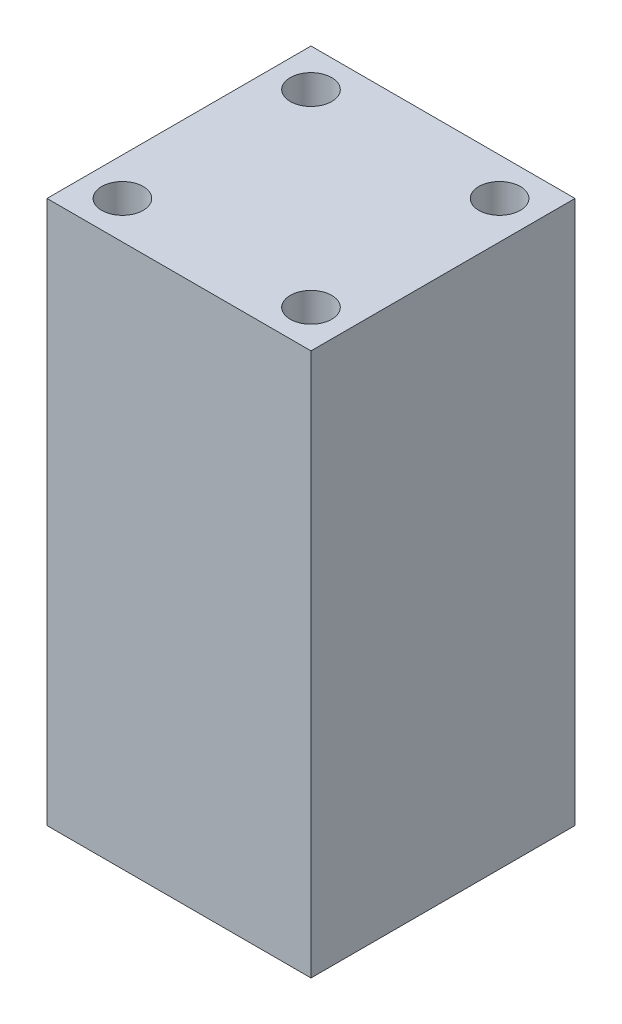
ISO-10303-21;
HEADER;
FILE_DESCRIPTION(('STEP AP214'),'2;1');
FILE_NAME('part.step','',(''),(''),'','','');
FILE_SCHEMA(('AUTOMOTIVE_DESIGN { 1 0 10303 214 1 1 1 1 }'));
ENDSEC;
DATA;
#1=APPLICATION_CONTEXT('core data for automotive mechanical design processes');
#2=APPLICATION_PROTOCOL_DEFINITION('international standard','automotive_design',2000,#1);
#3=PRODUCT_CONTEXT('',#1,'mechanical');
#4=PRODUCT('Part','Part','',(#3));
#5=PRODUCT_RELATED_PRODUCT_CATEGORY('part','',(#4));
#6=PRODUCT_DEFINITION_FORMATION('','',#4);
#7=PRODUCT_DEFINITION_CONTEXT('part definition',#1,'design');
#8=PRODUCT_DEFINITION('design','',#6,#7);
#9=PRODUCT_DEFINITION_SHAPE('','',#8);
#10=(LENGTH_UNIT() NAMED_UNIT(*) SI_UNIT(.MILLI.,.METRE.));
#11=(NAMED_UNIT(*) PLANE_ANGLE_UNIT() SI_UNIT($,.RADIAN.));
#12=(NAMED_UNIT(*) SI_UNIT($,.STERADIAN.) SOLID_ANGLE_UNIT());
#13=UNCERTAINTY_MEASURE_WITH_UNIT(LENGTH_MEASURE(1.E-05),#10,'distance_accuracy_value','');
#14=(GEOMETRIC_REPRESENTATION_CONTEXT(3) GLOBAL_UNCERTAINTY_ASSIGNED_CONTEXT((#13)) GLOBAL_UNIT_ASSIGNED_CONTEXT((#10,
#11,#12)) REPRESENTATION_CONTEXT('',''));
#15=CARTESIAN_POINT('',(0.,0.,0.));
#16=DIRECTION('',(0.,0.,1.));
#17=DIRECTION('',(1.,0.,0.));
#18=AXIS2_PLACEMENT_3D('',#15,#16,#17);
#19=CARTESIAN_POINT('',(17.5,36.,17.5));
#20=DIRECTION('',(-1.,0.,0.));
#21=DIRECTION('',(0.,0.,1.));
#22=AXIS2_PLACEMENT_3D('',#19,#20,#21);
#23=PLANE('',#22);
#24=DIRECTION('',(0.,1.,0.));
#25=VECTOR('',#24,1.);
#26=CARTESIAN_POINT('',(17.5,36.,-17.5));
#27=LINE('',#26,#25);
#28=CARTESIAN_POINT('',(17.5,-36.,-17.5));
#29=VERTEX_POINT('',#28);
#30=CARTESIAN_POINT('',(17.5,36.,-17.5));
#31=VERTEX_POINT('',#30);
#32=EDGE_CURVE('E206',#29,#31,#27,.T.);
#33=ORIENTED_EDGE('',*,*,#32,.T.);
#34=DIRECTION('',(0.,0.,-1.));
#35=VECTOR('',#34,1.);
#36=CARTESIAN_POINT('',(17.5,36.,17.5));
#37=LINE('',#36,#35);
#38=CARTESIAN_POINT('',(17.5,36.,17.5));
#39=VERTEX_POINT('',#38);
#40=EDGE_CURVE('E11',#39,#31,#37,.T.);
#41=ORIENTED_EDGE('',*,*,#40,.F.);
#42=DIRECTION('',(0.,1.,0.));
#43=VECTOR('',#42,1.);
#44=CARTESIAN_POINT('',(17.5,36.,17.5));
#45=LINE('',#44,#43);
#46=CARTESIAN_POINT('',(17.5,-36.,17.5));
#47=VERTEX_POINT('',#46);
#48=EDGE_CURVE('E207',#47,#39,#45,.T.);
#49=ORIENTED_EDGE('',*,*,#48,.F.);
#50=DIRECTION('',(0.,0.,-1.));
#51=VECTOR('',#50,1.);
#52=CARTESIAN_POINT('',(17.5,-36.,17.5));
#53=LINE('',#52,#51);
#54=EDGE_CURVE('E213',#47,#29,#53,.T.);
#55=ORIENTED_EDGE('',*,*,#54,.T.);
#56=EDGE_LOOP('',(#33,#41,#49,#55));
#57=FACE_BOUND('',#56,.T.);
#58=ADVANCED_FACE('F41',(#57),#23,.F.);
#59=CARTESIAN_POINT('',(-17.5,36.,17.5));
#60=DIRECTION('',(0.,-1.,0.));
#61=DIRECTION('',(0.,0.,-1.));
#62=AXIS2_PLACEMENT_3D('',#59,#60,#61);
#63=PLANE('',#62);
#64=CARTESIAN_POINT('',(12.5,36.,12.5));
#65=DIRECTION('',(0.,1.,0.));
#66=DIRECTION('',(0.,0.,1.));
#67=AXIS2_PLACEMENT_3D('',#64,#65,#66);
#68=CIRCLE('',#67,2.75);
#69=CARTESIAN_POINT('',(12.5,36.,15.25));
#70=VERTEX_POINT('',#69);
#71=EDGE_CURVE('E182',#70,#70,#68,.T.);
#72=ORIENTED_EDGE('',*,*,#71,.F.);
#73=EDGE_LOOP('',(#72));
#74=FACE_BOUND('',#73,.T.);
#75=CARTESIAN_POINT('',(-12.5,36.,12.5));
#76=DIRECTION('',(0.,1.,0.));
#77=DIRECTION('',(0.,0.,1.));
#78=AXIS2_PLACEMENT_3D('',#75,#76,#77);
#79=CIRCLE('',#78,2.75);
#80=CARTESIAN_POINT('',(-12.5,36.,15.25));
#81=VERTEX_POINT('',#80);
#82=EDGE_CURVE('E188',#81,#81,#79,.T.);
#83=ORIENTED_EDGE('',*,*,#82,.F.);
#84=EDGE_LOOP('',(#83));
#85=FACE_BOUND('',#84,.T.);
#86=CARTESIAN_POINT('',(12.5,36.,-12.5));
#87=DIRECTION('',(0.,1.,0.));
#88=DIRECTION('',(0.,0.,1.));
#89=AXIS2_PLACEMENT_3D('',#86,#87,#88);
#90=CIRCLE('',#89,2.75);
#91=CARTESIAN_POINT('',(12.5,36.,-9.75));
#92=VERTEX_POINT('',#91);
#93=EDGE_CURVE('E194',#92,#92,#90,.T.);
#94=ORIENTED_EDGE('',*,*,#93,.F.);
#95=EDGE_LOOP('',(#94));
#96=FACE_BOUND('',#95,.T.);
#97=CARTESIAN_POINT('',(-12.5,36.,-12.5));
#98=DIRECTION('',(0.,1.,0.));
#99=DIRECTION('',(0.,0.,1.));
#100=AXIS2_PLACEMENT_3D('',#97,#98,#99);
#101=CIRCLE('',#100,2.75);
#102=CARTESIAN_POINT('',(-12.5,36.,-9.75));
#103=VERTEX_POINT('',#102);
#104=EDGE_CURVE('E200',#103,#103,#101,.T.);
#105=ORIENTED_EDGE('',*,*,#104,.F.);
#106=EDGE_LOOP('',(#105));
#107=FACE_BOUND('',#106,.T.);
#108=DIRECTION('',(-1.,0.,0.));
#109=VECTOR('',#108,1.);
#110=CARTESIAN_POINT('',(-17.5,36.,-17.5));
#111=LINE('',#110,#109);
#112=CARTESIAN_POINT('',(-17.5,36.,-17.5));
#113=VERTEX_POINT('',#112);
#114=EDGE_CURVE('E216',#31,#113,#111,.T.);
#115=ORIENTED_EDGE('',*,*,#114,.T.);
#116=DIRECTION('',(0.,0.,-1.));
#117=VECTOR('',#116,1.);
#118=CARTESIAN_POINT('',(-17.5,36.,17.5));
#119=LINE('',#118,#117);
#120=CARTESIAN_POINT('',(-17.5,36.,17.5));
#121=VERTEX_POINT('',#120);
#122=EDGE_CURVE('E49',#121,#113,#119,.T.);
#123=ORIENTED_EDGE('',*,*,#122,.F.);
#124=DIRECTION('',(-1.,0.,0.));
#125=VECTOR('',#124,1.);
#126=CARTESIAN_POINT('',(-17.5,36.,17.5));
#127=LINE('',#126,#125);
#128=EDGE_CURVE('E88',#39,#121,#127,.T.);
#129=ORIENTED_EDGE('',*,*,#128,.F.);
#130=ORIENTED_EDGE('',*,*,#40,.T.);
#131=EDGE_LOOP('',(#115,#123,#129,#130));
#132=FACE_BOUND('',#131,.T.);
#133=ADVANCED_FACE('F242',(#74,#85,#96,#107,#132),#63,.F.);
#134=CARTESIAN_POINT('',(-17.5,36.,17.5));
#135=DIRECTION('',(1.,0.,0.));
#136=DIRECTION('',(0.,0.,-1.));
#137=AXIS2_PLACEMENT_3D('',#134,#135,#136);
#138=PLANE('',#137);
#139=CARTESIAN_POINT('',(-17.5,-15.,-12.5));
#140=DIRECTION('',(-1.,0.,0.));
#141=DIRECTION('',(0.,0.,1.));
#142=AXIS2_PLACEMENT_3D('',#139,#140,#141);
#143=CIRCLE('',#142,2.24999999999999);
#144=CARTESIAN_POINT('',(-17.5,-15.,-10.25));
#145=VERTEX_POINT('',#144);
#146=EDGE_CURVE('E136',#145,#145,#143,.T.);
#147=ORIENTED_EDGE('',*,*,#146,.F.);
#148=EDGE_LOOP('',(#147));
#149=FACE_BOUND('',#148,.T.);
#150=CARTESIAN_POINT('',(-17.5,-15.,12.5));
#151=DIRECTION('',(-1.,0.,0.));
#152=DIRECTION('',(0.,0.,1.));
#153=AXIS2_PLACEMENT_3D('',#150,#151,#152);
#154=CIRCLE('',#153,2.24999999999999);
#155=CARTESIAN_POINT('',(-17.5,-15.,14.75));
#156=VERTEX_POINT('',#155);
#157=EDGE_CURVE('E135',#156,#156,#154,.T.);
#158=ORIENTED_EDGE('',*,*,#157,.F.);
#159=EDGE_LOOP('',(#158));
#160=FACE_BOUND('',#159,.T.);
#161=CARTESIAN_POINT('',(-17.5,15.,12.5));
#162=DIRECTION('',(-1.,0.,0.));
#163=DIRECTION('',(0.,0.,1.));
#164=AXIS2_PLACEMENT_3D('',#161,#162,#163);
#165=CIRCLE('',#164,2.24999999999999);
#166=CARTESIAN_POINT('',(-17.5,15.,14.75));
#167=VERTEX_POINT('',#166);
#168=EDGE_CURVE('E146',#167,#167,#165,.T.);
#169=ORIENTED_EDGE('',*,*,#168,.F.);
#170=EDGE_LOOP('',(#169));
#171=FACE_BOUND('',#170,.T.);
#172=CARTESIAN_POINT('',(-17.5,15.,-12.5));
#173=DIRECTION('',(-1.,0.,0.));
#174=DIRECTION('',(0.,0.,1.));
#175=AXIS2_PLACEMENT_3D('',#172,#173,#174);
#176=CIRCLE('',#175,2.24999999999999);
#177=CARTESIAN_POINT('',(-17.5,15.,-10.25));
#178=VERTEX_POINT('',#177);
#179=EDGE_CURVE('E152',#178,#178,#176,.T.);
#180=ORIENTED_EDGE('',*,*,#179,.F.);
#181=EDGE_LOOP('',(#180));
#182=FACE_BOUND('',#181,.T.);
#183=DIRECTION('',(0.,-1.,0.));
#184=VECTOR('',#183,1.);
#185=CARTESIAN_POINT('',(-17.5,36.,-17.5));
#186=LINE('',#185,#184);
#187=CARTESIAN_POINT('',(-17.5,-36.,-17.5));
#188=VERTEX_POINT('',#187);
#189=EDGE_CURVE('E75',#113,#188,#186,.T.);
#190=ORIENTED_EDGE('',*,*,#189,.T.);
#191=DIRECTION('',(0.,0.,-1.));
#192=VECTOR('',#191,1.);
#193=CARTESIAN_POINT('',(-17.5,-36.,17.5));
#194=LINE('',#193,#192);
#195=CARTESIAN_POINT('',(-17.5,-36.,17.5));
#196=VERTEX_POINT('',#195);
#197=EDGE_CURVE('E221',#196,#188,#194,.T.);
#198=ORIENTED_EDGE('',*,*,#197,.F.);
#199=DIRECTION('',(0.,-1.,0.));
#200=VECTOR('',#199,1.);
#201=CARTESIAN_POINT('',(-17.5,36.,17.5));
#202=LINE('',#201,#200);
#203=EDGE_CURVE('E210',#121,#196,#202,.T.);
#204=ORIENTED_EDGE('',*,*,#203,.F.);
#205=ORIENTED_EDGE('',*,*,#122,.T.);
#206=EDGE_LOOP('',(#190,#198,#204,#205));
#207=FACE_BOUND('',#206,.T.);
#208=ADVANCED_FACE('F223',(#149,#160,#171,#182,#207),#138,.F.);
#209=CARTESIAN_POINT('',(-17.5,-36.,17.5));
#210=DIRECTION('',(0.,1.,0.));
#211=DIRECTION('',(0.,0.,1.));
#212=AXIS2_PLACEMENT_3D('',#209,#210,#211);
#213=PLANE('',#212);
#214=CARTESIAN_POINT('',(12.5,-36.,12.5));
#215=DIRECTION('',(0.,-1.,0.));
#216=DIRECTION('',(0.,0.,-1.));
#217=AXIS2_PLACEMENT_3D('',#214,#215,#216);
#218=CIRCLE('',#217,2.75);
#219=CARTESIAN_POINT('',(12.5,-36.,9.75));
#220=VERTEX_POINT('',#219);
#221=EDGE_CURVE('E158',#220,#220,#218,.T.);
#222=ORIENTED_EDGE('',*,*,#221,.F.);
#223=EDGE_LOOP('',(#222));
#224=FACE_BOUND('',#223,.T.);
#225=CARTESIAN_POINT('',(-12.5,-36.,12.5));
#226=DIRECTION('',(0.,-1.,0.));
#227=DIRECTION('',(0.,0.,-1.));
#228=AXIS2_PLACEMENT_3D('',#225,#226,#227);
#229=CIRCLE('',#228,2.75);
#230=CARTESIAN_POINT('',(-12.5,-36.,9.75));
#231=VERTEX_POINT('',#230);
#232=EDGE_CURVE('E164',#231,#231,#229,.T.);
#233=ORIENTED_EDGE('',*,*,#232,.F.);
#234=EDGE_LOOP('',(#233));
#235=FACE_BOUND('',#234,.T.);
#236=CARTESIAN_POINT('',(12.5,-36.,-12.5));
#237=DIRECTION('',(0.,-1.,0.));
#238=DIRECTION('',(0.,0.,-1.));
#239=AXIS2_PLACEMENT_3D('',#236,#237,#238);
#240=CIRCLE('',#239,2.75);
#241=CARTESIAN_POINT('',(12.5,-36.,-15.25));
#242=VERTEX_POINT('',#241);
#243=EDGE_CURVE('E170',#242,#242,#240,.T.);
#244=ORIENTED_EDGE('',*,*,#243,.F.);
#245=EDGE_LOOP('',(#244));
#246=FACE_BOUND('',#245,.T.);
#247=CARTESIAN_POINT('',(-12.5,-36.,-12.5));
#248=DIRECTION('',(0.,-1.,0.));
#249=DIRECTION('',(0.,0.,-1.));
#250=AXIS2_PLACEMENT_3D('',#247,#248,#249);
#251=CIRCLE('',#250,2.75);
#252=CARTESIAN_POINT('',(-12.5,-36.,-15.25));
#253=VERTEX_POINT('',#252);
#254=EDGE_CURVE('E176',#253,#253,#251,.T.);
#255=ORIENTED_EDGE('',*,*,#254,.F.);
#256=EDGE_LOOP('',(#255));
#257=FACE_BOUND('',#256,.T.);
#258=DIRECTION('',(1.,0.,0.));
#259=VECTOR('',#258,1.);
#260=CARTESIAN_POINT('',(-17.5,-36.,-17.5));
#261=LINE('',#260,#259);
#262=EDGE_CURVE('E81',#188,#29,#261,.T.);
#263=ORIENTED_EDGE('',*,*,#262,.T.);
#264=ORIENTED_EDGE('',*,*,#54,.F.);
#265=DIRECTION('',(1.,0.,0.));
#266=VECTOR('',#265,1.);
#267=CARTESIAN_POINT('',(-17.5,-36.,17.5));
#268=LINE('',#267,#266);
#269=EDGE_CURVE('E57',#196,#47,#268,.T.);
#270=ORIENTED_EDGE('',*,*,#269,.F.);
#271=ORIENTED_EDGE('',*,*,#197,.T.);
#272=EDGE_LOOP('',(#263,#264,#270,#271));
#273=FACE_BOUND('',#272,.T.);
#274=ADVANCED_FACE('F230',(#224,#235,#246,#257,#273),#213,.F.);
#275=CARTESIAN_POINT('',(0.,0.,17.5));
#276=DIRECTION('',(0.,0.,1.));
#277=DIRECTION('',(1.,0.,0.));
#278=AXIS2_PLACEMENT_3D('',#275,#276,#277);
#279=PLANE('',#278);
#280=ORIENTED_EDGE('',*,*,#48,.T.);
#281=ORIENTED_EDGE('',*,*,#128,.T.);
#282=ORIENTED_EDGE('',*,*,#203,.T.);
#283=ORIENTED_EDGE('',*,*,#269,.T.);
#284=EDGE_LOOP('',(#280,#281,#282,#283));
#285=FACE_BOUND('',#284,.T.);
#286=ADVANCED_FACE('F232',(#285),#279,.T.);
#287=CARTESIAN_POINT('',(0.,0.,-17.5));
#288=DIRECTION('',(0.,0.,1.));
#289=DIRECTION('',(1.,0.,0.));
#290=AXIS2_PLACEMENT_3D('',#287,#288,#289);
#291=PLANE('',#290);
#292=ORIENTED_EDGE('',*,*,#32,.F.);
#293=ORIENTED_EDGE('',*,*,#262,.F.);
#294=ORIENTED_EDGE('',*,*,#189,.F.);
#295=ORIENTED_EDGE('',*,*,#114,.F.);
#296=EDGE_LOOP('',(#292,#293,#294,#295));
#297=FACE_BOUND('',#296,.T.);
#298=ADVANCED_FACE('F226',(#297),#291,.F.);
#299=CARTESIAN_POINT('',(-12.5,28.,-12.5));
#300=DIRECTION('',(0.,1.,0.));
#301=DIRECTION('',(0.,0.,1.));
#302=AXIS2_PLACEMENT_3D('',#299,#300,#301);
#303=CONICAL_SURFACE('',#302,2.75,1.02974425867665);
#304=CARTESIAN_POINT('',(-12.5,26.3476332976742,-12.5));
#305=VERTEX_POINT('',#304);
#306=VERTEX_LOOP('',#305);
#307=FACE_BOUND('',#306,.T.);
#308=CARTESIAN_POINT('',(-12.5,28.,-12.5));
#309=DIRECTION('',(0.,1.,0.));
#310=DIRECTION('',(0.,0.,1.));
#311=AXIS2_PLACEMENT_3D('',#308,#309,#310);
#312=CIRCLE('',#311,2.75);
#313=CARTESIAN_POINT('',(-12.5,28.,-9.75));
#314=VERTEX_POINT('',#313);
#315=EDGE_CURVE('E203',#314,#314,#312,.T.);
#316=ORIENTED_EDGE('',*,*,#315,.T.);
#317=EDGE_LOOP('',(#316));
#318=FACE_BOUND('',#317,.T.);
#319=ADVANCED_FACE('F268',(#307,#318),#303,.F.);
#320=CARTESIAN_POINT('',(-12.5,36.,-12.5));
#321=DIRECTION('',(0.,1.,0.));
#322=DIRECTION('',(0.,0.,1.));
#323=AXIS2_PLACEMENT_3D('',#320,#321,#322);
#324=CYLINDRICAL_SURFACE('',#323,2.75);
#325=ORIENTED_EDGE('',*,*,#315,.F.);
#326=EDGE_LOOP('',(#325));
#327=FACE_BOUND('',#326,.T.);
#328=ORIENTED_EDGE('',*,*,#104,.T.);
#329=EDGE_LOOP('',(#328));
#330=FACE_BOUND('',#329,.T.);
#331=ADVANCED_FACE('F265',(#327,#330),#324,.F.);
#332=CARTESIAN_POINT('',(12.5,28.,-12.5));
#333=DIRECTION('',(0.,1.,0.));
#334=DIRECTION('',(0.,0.,1.));
#335=AXIS2_PLACEMENT_3D('',#332,#333,#334);
#336=CONICAL_SURFACE('',#335,2.75,1.02974425867665);
#337=CARTESIAN_POINT('',(12.5,26.3476332976742,-12.5));
#338=VERTEX_POINT('',#337);
#339=VERTEX_LOOP('',#338);
#340=FACE_BOUND('',#339,.T.);
#341=CARTESIAN_POINT('',(12.5,28.,-12.5));
#342=DIRECTION('',(0.,1.,0.));
#343=DIRECTION('',(0.,0.,1.));
#344=AXIS2_PLACEMENT_3D('',#341,#342,#343);
#345=CIRCLE('',#344,2.75);
#346=CARTESIAN_POINT('',(12.5,28.,-9.75));
#347=VERTEX_POINT('',#346);
#348=EDGE_CURVE('E197',#347,#347,#345,.T.);
#349=ORIENTED_EDGE('',*,*,#348,.T.);
#350=EDGE_LOOP('',(#349));
#351=FACE_BOUND('',#350,.T.);
#352=ADVANCED_FACE('F267',(#340,#351),#336,.F.);
#353=CARTESIAN_POINT('',(12.5,36.,-12.5));
#354=DIRECTION('',(0.,1.,0.));
#355=DIRECTION('',(0.,0.,1.));
#356=AXIS2_PLACEMENT_3D('',#353,#354,#355);
#357=CYLINDRICAL_SURFACE('',#356,2.75);
#358=ORIENTED_EDGE('',*,*,#348,.F.);
#359=EDGE_LOOP('',(#358));
#360=FACE_BOUND('',#359,.T.);
#361=ORIENTED_EDGE('',*,*,#93,.T.);
#362=EDGE_LOOP('',(#361));
#363=FACE_BOUND('',#362,.T.);
#364=ADVANCED_FACE('F275',(#360,#363),#357,.F.);
#365=CARTESIAN_POINT('',(-12.5,28.,12.5));
#366=DIRECTION('',(0.,1.,0.));
#367=DIRECTION('',(0.,0.,1.));
#368=AXIS2_PLACEMENT_3D('',#365,#366,#367);
#369=CONICAL_SURFACE('',#368,2.75,1.02974425867665);
#370=CARTESIAN_POINT('',(-12.5,26.3476332976742,12.5));
#371=VERTEX_POINT('',#370);
#372=VERTEX_LOOP('',#371);
#373=FACE_BOUND('',#372,.T.);
#374=CARTESIAN_POINT('',(-12.5,28.,12.5));
#375=DIRECTION('',(0.,1.,0.));
#376=DIRECTION('',(0.,0.,1.));
#377=AXIS2_PLACEMENT_3D('',#374,#375,#376);
#378=CIRCLE('',#377,2.75);
#379=CARTESIAN_POINT('',(-12.5,28.,15.25));
#380=VERTEX_POINT('',#379);
#381=EDGE_CURVE('E191',#380,#380,#378,.T.);
#382=ORIENTED_EDGE('',*,*,#381,.T.);
#383=EDGE_LOOP('',(#382));
#384=FACE_BOUND('',#383,.T.);
#385=ADVANCED_FACE('F311',(#373,#384),#369,.F.);
#386=CARTESIAN_POINT('',(-12.5,36.,12.5));
#387=DIRECTION('',(0.,1.,0.));
#388=DIRECTION('',(0.,0.,1.));
#389=AXIS2_PLACEMENT_3D('',#386,#387,#388);
#390=CYLINDRICAL_SURFACE('',#389,2.75);
#391=ORIENTED_EDGE('',*,*,#381,.F.);
#392=EDGE_LOOP('',(#391));
#393=FACE_BOUND('',#392,.T.);
#394=ORIENTED_EDGE('',*,*,#82,.T.);
#395=EDGE_LOOP('',(#394));
#396=FACE_BOUND('',#395,.T.);
#397=ADVANCED_FACE('F319',(#393,#396),#390,.F.);
#398=CARTESIAN_POINT('',(12.5,28.,12.5));
#399=DIRECTION('',(0.,1.,0.));
#400=DIRECTION('',(0.,0.,1.));
#401=AXIS2_PLACEMENT_3D('',#398,#399,#400);
#402=CONICAL_SURFACE('',#401,2.75,1.02974425867665);
#403=CARTESIAN_POINT('',(12.5,26.3476332976742,12.5));
#404=VERTEX_POINT('',#403);
#405=VERTEX_LOOP('',#404);
#406=FACE_BOUND('',#405,.T.);
#407=CARTESIAN_POINT('',(12.5,28.,12.5));
#408=DIRECTION('',(0.,1.,0.));
#409=DIRECTION('',(0.,0.,1.));
#410=AXIS2_PLACEMENT_3D('',#407,#408,#409);
#411=CIRCLE('',#410,2.75);
#412=CARTESIAN_POINT('',(12.5,28.,15.25));
#413=VERTEX_POINT('',#412);
#414=EDGE_CURVE('E185',#413,#413,#411,.T.);
#415=ORIENTED_EDGE('',*,*,#414,.T.);
#416=EDGE_LOOP('',(#415));
#417=FACE_BOUND('',#416,.T.);
#418=ADVANCED_FACE('F329',(#406,#417),#402,.F.);
#419=CARTESIAN_POINT('',(12.5,36.,12.5));
#420=DIRECTION('',(0.,1.,0.));
#421=DIRECTION('',(0.,0.,1.));
#422=AXIS2_PLACEMENT_3D('',#419,#420,#421);
#423=CYLINDRICAL_SURFACE('',#422,2.75);
#424=ORIENTED_EDGE('',*,*,#414,.F.);
#425=EDGE_LOOP('',(#424));
#426=FACE_BOUND('',#425,.T.);
#427=ORIENTED_EDGE('',*,*,#71,.T.);
#428=EDGE_LOOP('',(#427));
#429=FACE_BOUND('',#428,.T.);
#430=ADVANCED_FACE('F339',(#426,#429),#423,.F.);
#431=CARTESIAN_POINT('',(-12.5,-28.,-12.5));
#432=DIRECTION('',(0.,-1.,0.));
#433=DIRECTION('',(0.,0.,-1.));
#434=AXIS2_PLACEMENT_3D('',#431,#432,#433);
#435=CONICAL_SURFACE('',#434,2.75,1.02974425867665);
#436=CARTESIAN_POINT('',(-12.5,-26.3476332976742,-12.5));
#437=VERTEX_POINT('',#436);
#438=VERTEX_LOOP('',#437);
#439=FACE_BOUND('',#438,.T.);
#440=CARTESIAN_POINT('',(-12.5,-28.,-12.5));
#441=DIRECTION('',(0.,-1.,0.));
#442=DIRECTION('',(0.,0.,-1.));
#443=AXIS2_PLACEMENT_3D('',#440,#441,#442);
#444=CIRCLE('',#443,2.75);
#445=CARTESIAN_POINT('',(-12.5,-28.,-15.25));
#446=VERTEX_POINT('',#445);
#447=EDGE_CURVE('E179',#446,#446,#444,.T.);
#448=ORIENTED_EDGE('',*,*,#447,.T.);
#449=EDGE_LOOP('',(#448));
#450=FACE_BOUND('',#449,.T.);
#451=ADVANCED_FACE('F348',(#439,#450),#435,.F.);
#452=CARTESIAN_POINT('',(-12.5,-36.,-12.5));
#453=DIRECTION('',(0.,-1.,0.));
#454=DIRECTION('',(0.,0.,-1.));
#455=AXIS2_PLACEMENT_3D('',#452,#453,#454);
#456=CYLINDRICAL_SURFACE('',#455,2.75);
#457=ORIENTED_EDGE('',*,*,#447,.F.);
#458=EDGE_LOOP('',(#457));
#459=FACE_BOUND('',#458,.T.);
#460=ORIENTED_EDGE('',*,*,#254,.T.);
#461=EDGE_LOOP('',(#460));
#462=FACE_BOUND('',#461,.T.);
#463=ADVANCED_FACE('F357',(#459,#462),#456,.F.);
#464=CARTESIAN_POINT('',(12.5,-28.,-12.5));
#465=DIRECTION('',(0.,-1.,0.));
#466=DIRECTION('',(0.,0.,-1.));
#467=AXIS2_PLACEMENT_3D('',#464,#465,#466);
#468=CONICAL_SURFACE('',#467,2.75,1.02974425867665);
#469=CARTESIAN_POINT('',(12.5,-26.3476332976742,-12.5));
#470=VERTEX_POINT('',#469);
#471=VERTEX_LOOP('',#470);
#472=FACE_BOUND('',#471,.T.);
#473=CARTESIAN_POINT('',(12.5,-28.,-12.5));
#474=DIRECTION('',(0.,-1.,0.));
#475=DIRECTION('',(0.,0.,-1.));
#476=AXIS2_PLACEMENT_3D('',#473,#474,#475);
#477=CIRCLE('',#476,2.75);
#478=CARTESIAN_POINT('',(12.5,-28.,-15.25));
#479=VERTEX_POINT('',#478);
#480=EDGE_CURVE('E173',#479,#479,#477,.T.);
#481=ORIENTED_EDGE('',*,*,#480,.T.);
#482=EDGE_LOOP('',(#481));
#483=FACE_BOUND('',#482,.T.);
#484=ADVANCED_FACE('F367',(#472,#483),#468,.F.);
#485=CARTESIAN_POINT('',(12.5,-36.,-12.5));
#486=DIRECTION('',(0.,-1.,0.));
#487=DIRECTION('',(0.,0.,-1.));
#488=AXIS2_PLACEMENT_3D('',#485,#486,#487);
#489=CYLINDRICAL_SURFACE('',#488,2.75);
#490=ORIENTED_EDGE('',*,*,#480,.F.);
#491=EDGE_LOOP('',(#490));
#492=FACE_BOUND('',#491,.T.);
#493=ORIENTED_EDGE('',*,*,#243,.T.);
#494=EDGE_LOOP('',(#493));
#495=FACE_BOUND('',#494,.T.);
#496=ADVANCED_FACE('F377',(#492,#495),#489,.F.);
#497=CARTESIAN_POINT('',(-12.5,-28.,12.5));
#498=DIRECTION('',(0.,-1.,0.));
#499=DIRECTION('',(0.,0.,-1.));
#500=AXIS2_PLACEMENT_3D('',#497,#498,#499);
#501=CONICAL_SURFACE('',#500,2.75,1.02974425867665);
#502=CARTESIAN_POINT('',(-12.5,-26.3476332976742,12.5));
#503=VERTEX_POINT('',#502);
#504=VERTEX_LOOP('',#503);
#505=FACE_BOUND('',#504,.T.);
#506=CARTESIAN_POINT('',(-12.5,-28.,12.5));
#507=DIRECTION('',(0.,-1.,0.));
#508=DIRECTION('',(0.,0.,-1.));
#509=AXIS2_PLACEMENT_3D('',#506,#507,#508);
#510=CIRCLE('',#509,2.75);
#511=CARTESIAN_POINT('',(-12.5,-28.,9.75));
#512=VERTEX_POINT('',#511);
#513=EDGE_CURVE('E167',#512,#512,#510,.T.);
#514=ORIENTED_EDGE('',*,*,#513,.T.);
#515=EDGE_LOOP('',(#514));
#516=FACE_BOUND('',#515,.T.);
#517=ADVANCED_FACE('F387',(#505,#516),#501,.F.);
#518=CARTESIAN_POINT('',(-12.5,-36.,12.5));
#519=DIRECTION('',(0.,-1.,0.));
#520=DIRECTION('',(0.,0.,-1.));
#521=AXIS2_PLACEMENT_3D('',#518,#519,#520);
#522=CYLINDRICAL_SURFACE('',#521,2.75);
#523=ORIENTED_EDGE('',*,*,#513,.F.);
#524=EDGE_LOOP('',(#523));
#525=FACE_BOUND('',#524,.T.);
#526=ORIENTED_EDGE('',*,*,#232,.T.);
#527=EDGE_LOOP('',(#526));
#528=FACE_BOUND('',#527,.T.);
#529=ADVANCED_FACE('F397',(#525,#528),#522,.F.);
#530=CARTESIAN_POINT('',(12.5,-28.,12.5));
#531=DIRECTION('',(0.,-1.,0.));
#532=DIRECTION('',(0.,0.,-1.));
#533=AXIS2_PLACEMENT_3D('',#530,#531,#532);
#534=CONICAL_SURFACE('',#533,2.75,1.02974425867665);
#535=CARTESIAN_POINT('',(12.5,-26.3476332976742,12.5));
#536=VERTEX_POINT('',#535);
#537=VERTEX_LOOP('',#536);
#538=FACE_BOUND('',#537,.T.);
#539=CARTESIAN_POINT('',(12.5,-28.,12.5));
#540=DIRECTION('',(0.,-1.,0.));
#541=DIRECTION('',(0.,0.,-1.));
#542=AXIS2_PLACEMENT_3D('',#539,#540,#541);
#543=CIRCLE('',#542,2.75);
#544=CARTESIAN_POINT('',(12.5,-28.,9.75));
#545=VERTEX_POINT('',#544);
#546=EDGE_CURVE('E161',#545,#545,#543,.T.);
#547=ORIENTED_EDGE('',*,*,#546,.T.);
#548=EDGE_LOOP('',(#547));
#549=FACE_BOUND('',#548,.T.);
#550=ADVANCED_FACE('F407',(#538,#549),#534,.F.);
#551=CARTESIAN_POINT('',(12.5,-36.,12.5));
#552=DIRECTION('',(0.,-1.,0.));
#553=DIRECTION('',(0.,0.,-1.));
#554=AXIS2_PLACEMENT_3D('',#551,#552,#553);
#555=CYLINDRICAL_SURFACE('',#554,2.75);
#556=ORIENTED_EDGE('',*,*,#546,.F.);
#557=EDGE_LOOP('',(#556));
#558=FACE_BOUND('',#557,.T.);
#559=ORIENTED_EDGE('',*,*,#221,.T.);
#560=EDGE_LOOP('',(#559));
#561=FACE_BOUND('',#560,.T.);
#562=ADVANCED_FACE('F417',(#558,#561),#555,.F.);
#563=CARTESIAN_POINT('',(-9.49999999999999,15.,-12.5));
#564=DIRECTION('',(-1.,0.,0.));
#565=DIRECTION('',(0.,0.,1.));
#566=AXIS2_PLACEMENT_3D('',#563,#564,#565);
#567=CONICAL_SURFACE('',#566,2.24999999999999,1.02974425867665);
#568=CARTESIAN_POINT('',(-8.14806360718799,15.,-12.5));
#569=VERTEX_POINT('',#568);
#570=VERTEX_LOOP('',#569);
#571=FACE_BOUND('',#570,.T.);
#572=CARTESIAN_POINT('',(-9.49999999999999,15.,-12.5));
#573=DIRECTION('',(-1.,0.,0.));
#574=DIRECTION('',(0.,0.,1.));
#575=AXIS2_PLACEMENT_3D('',#572,#573,#574);
#576=CIRCLE('',#575,2.24999999999999);
#577=CARTESIAN_POINT('',(-9.49999999999999,15.,-10.25));
#578=VERTEX_POINT('',#577);
#579=EDGE_CURVE('E155',#578,#578,#576,.T.);
#580=ORIENTED_EDGE('',*,*,#579,.T.);
#581=EDGE_LOOP('',(#580));
#582=FACE_BOUND('',#581,.T.);
#583=ADVANCED_FACE('F427',(#571,#582),#567,.F.);
#584=CARTESIAN_POINT('',(-17.5,15.,-12.5));
#585=DIRECTION('',(-1.,0.,0.));
#586=DIRECTION('',(0.,0.,1.));
#587=AXIS2_PLACEMENT_3D('',#584,#585,#586);
#588=CYLINDRICAL_SURFACE('',#587,2.24999999999999);
#589=ORIENTED_EDGE('',*,*,#579,.F.);
#590=EDGE_LOOP('',(#589));
#591=FACE_BOUND('',#590,.T.);
#592=ORIENTED_EDGE('',*,*,#179,.T.);
#593=EDGE_LOOP('',(#592));
#594=FACE_BOUND('',#593,.T.);
#595=ADVANCED_FACE('F437',(#591,#594),#588,.F.);
#596=CARTESIAN_POINT('',(-9.49999999999999,15.,12.5));
#597=DIRECTION('',(-1.,0.,0.));
#598=DIRECTION('',(0.,0.,1.));
#599=AXIS2_PLACEMENT_3D('',#596,#597,#598);
#600=CONICAL_SURFACE('',#599,2.24999999999999,1.02974425867665);
#601=CARTESIAN_POINT('',(-8.14806360718799,15.,12.5));
#602=VERTEX_POINT('',#601);
#603=VERTEX_LOOP('',#602);
#604=FACE_BOUND('',#603,.T.);
#605=CARTESIAN_POINT('',(-9.49999999999999,15.,12.5));
#606=DIRECTION('',(-1.,0.,0.));
#607=DIRECTION('',(0.,0.,1.));
#608=AXIS2_PLACEMENT_3D('',#605,#606,#607);
#609=CIRCLE('',#608,2.24999999999999);
#610=CARTESIAN_POINT('',(-9.49999999999999,15.,14.75));
#611=VERTEX_POINT('',#610);
#612=EDGE_CURVE('E149',#611,#611,#609,.T.);
#613=ORIENTED_EDGE('',*,*,#612,.T.);
#614=EDGE_LOOP('',(#613));
#615=FACE_BOUND('',#614,.T.);
#616=ADVANCED_FACE('F447',(#604,#615),#600,.F.);
#617=CARTESIAN_POINT('',(-17.5,15.,12.5));
#618=DIRECTION('',(-1.,0.,0.));
#619=DIRECTION('',(0.,0.,1.));
#620=AXIS2_PLACEMENT_3D('',#617,#618,#619);
#621=CYLINDRICAL_SURFACE('',#620,2.24999999999999);
#622=ORIENTED_EDGE('',*,*,#612,.F.);
#623=EDGE_LOOP('',(#622));
#624=FACE_BOUND('',#623,.T.);
#625=ORIENTED_EDGE('',*,*,#168,.T.);
#626=EDGE_LOOP('',(#625));
#627=FACE_BOUND('',#626,.T.);
#628=ADVANCED_FACE('F457',(#624,#627),#621,.F.);
#629=CARTESIAN_POINT('',(-9.49999999999999,-15.,12.5));
#630=DIRECTION('',(-1.,0.,0.));
#631=DIRECTION('',(0.,0.,1.));
#632=AXIS2_PLACEMENT_3D('',#629,#630,#631);
#633=CONICAL_SURFACE('',#632,2.24999999999999,1.02974425867665);
#634=CARTESIAN_POINT('',(-8.14806360718799,-15.,12.5));
#635=VERTEX_POINT('',#634);
#636=VERTEX_LOOP('',#635);
#637=FACE_BOUND('',#636,.T.);
#638=CARTESIAN_POINT('',(-9.49999999999999,-15.,12.5));
#639=DIRECTION('',(-1.,0.,0.));
#640=DIRECTION('',(0.,0.,1.));
#641=AXIS2_PLACEMENT_3D('',#638,#639,#640);
#642=CIRCLE('',#641,2.24999999999999);
#643=CARTESIAN_POINT('',(-9.49999999999999,-15.,14.75));
#644=VERTEX_POINT('',#643);
#645=EDGE_CURVE('E139',#644,#644,#642,.T.);
#646=ORIENTED_EDGE('',*,*,#645,.T.);
#647=EDGE_LOOP('',(#646));
#648=FACE_BOUND('',#647,.T.);
#649=ADVANCED_FACE('F467',(#637,#648),#633,.F.);
#650=CARTESIAN_POINT('',(-17.5,-15.,12.5));
#651=DIRECTION('',(-1.,0.,0.));
#652=DIRECTION('',(0.,0.,1.));
#653=AXIS2_PLACEMENT_3D('',#650,#651,#652);
#654=CYLINDRICAL_SURFACE('',#653,2.24999999999999);
#655=ORIENTED_EDGE('',*,*,#645,.F.);
#656=EDGE_LOOP('',(#655));
#657=FACE_BOUND('',#656,.T.);
#658=ORIENTED_EDGE('',*,*,#157,.T.);
#659=EDGE_LOOP('',(#658));
#660=FACE_BOUND('',#659,.T.);
#661=ADVANCED_FACE('F129',(#657,#660),#654,.F.);
#662=CARTESIAN_POINT('',(-9.49999999999999,-15.,-12.5));
#663=DIRECTION('',(-1.,0.,0.));
#664=DIRECTION('',(0.,0.,1.));
#665=AXIS2_PLACEMENT_3D('',#662,#663,#664);
#666=CONICAL_SURFACE('',#665,2.24999999999999,1.02974425867665);
#667=CARTESIAN_POINT('',(-8.14806360718799,-15.,-12.5));
#668=VERTEX_POINT('',#667);
#669=VERTEX_LOOP('',#668);
#670=FACE_BOUND('',#669,.T.);
#671=CARTESIAN_POINT('',(-9.49999999999999,-15.,-12.5));
#672=DIRECTION('',(-1.,0.,0.));
#673=DIRECTION('',(0.,0.,1.));
#674=AXIS2_PLACEMENT_3D('',#671,#672,#673);
#675=CIRCLE('',#674,2.24999999999999);
#676=CARTESIAN_POINT('',(-9.49999999999999,-15.,-10.25));
#677=VERTEX_POINT('',#676);
#678=EDGE_CURVE('E133',#677,#677,#675,.T.);
#679=ORIENTED_EDGE('',*,*,#678,.T.);
#680=EDGE_LOOP('',(#679));
#681=FACE_BOUND('',#680,.T.);
#682=ADVANCED_FACE('F125',(#670,#681),#666,.F.);
#683=CARTESIAN_POINT('',(-17.5,-15.,-12.5));
#684=DIRECTION('',(-1.,0.,0.));
#685=DIRECTION('',(0.,0.,1.));
#686=AXIS2_PLACEMENT_3D('',#683,#684,#685);
#687=CYLINDRICAL_SURFACE('',#686,2.24999999999999);
#688=ORIENTED_EDGE('',*,*,#678,.F.);
#689=EDGE_LOOP('',(#688));
#690=FACE_BOUND('',#689,.T.);
#691=ORIENTED_EDGE('',*,*,#146,.T.);
#692=EDGE_LOOP('',(#691));
#693=FACE_BOUND('',#692,.T.);
#694=ADVANCED_FACE('F128',(#690,#693),#687,.F.);
#695=CLOSED_SHELL('',(#58,#133,#208,#274,#286,#298,#319,#331,#352,#364,#385,#397,#418,#430,#451,
#463,#484,#496,#517,#529,#550,#562,#583,#595,#616,#628,#649,#661,#682,#694));
#696=MANIFOLD_SOLID_BREP('B2',#695);
#697=ADVANCED_BREP_SHAPE_REPRESENTATION('',(#18,#696),#14);
#698=SHAPE_DEFINITION_REPRESENTATION(#9,#697);
ENDSEC;
END-ISO-10303-21;
